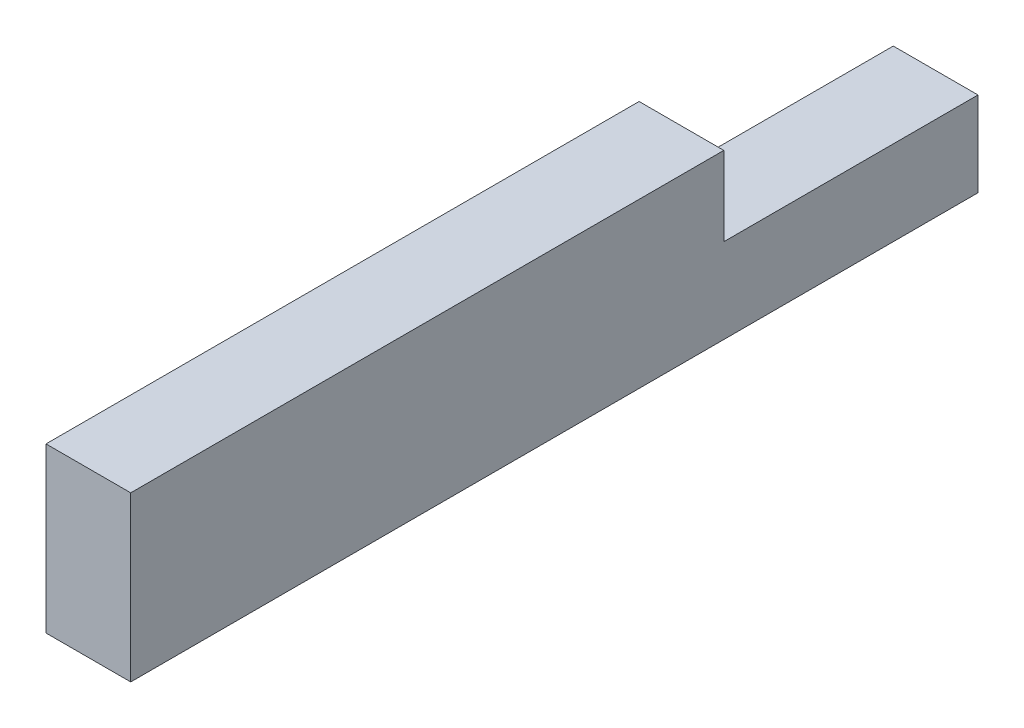
ISO-10303-21;
HEADER;
FILE_DESCRIPTION(('STEP AP214'),'2;1');
FILE_NAME('part.step','',(''),(''),'','','');
FILE_SCHEMA(('AUTOMOTIVE_DESIGN { 1 0 10303 214 1 1 1 1 }'));
ENDSEC;
DATA;
#1=APPLICATION_CONTEXT('core data for automotive mechanical design processes');
#2=APPLICATION_PROTOCOL_DEFINITION('international standard','automotive_design',2000,#1);
#3=PRODUCT_CONTEXT('',#1,'mechanical');
#4=PRODUCT('Part','Part','',(#3));
#5=PRODUCT_RELATED_PRODUCT_CATEGORY('part','',(#4));
#6=PRODUCT_DEFINITION_FORMATION('','',#4);
#7=PRODUCT_DEFINITION_CONTEXT('part definition',#1,'design');
#8=PRODUCT_DEFINITION('design','',#6,#7);
#9=PRODUCT_DEFINITION_SHAPE('','',#8);
#10=(LENGTH_UNIT() NAMED_UNIT(*) SI_UNIT(.MILLI.,.METRE.));
#11=(NAMED_UNIT(*) PLANE_ANGLE_UNIT() SI_UNIT($,.RADIAN.));
#12=(NAMED_UNIT(*) SI_UNIT($,.STERADIAN.) SOLID_ANGLE_UNIT());
#13=UNCERTAINTY_MEASURE_WITH_UNIT(LENGTH_MEASURE(1.E-05),#10,'distance_accuracy_value','');
#14=(GEOMETRIC_REPRESENTATION_CONTEXT(3) GLOBAL_UNCERTAINTY_ASSIGNED_CONTEXT((#13)) GLOBAL_UNIT_ASSIGNED_CONTEXT((#10,
#11,#12)) REPRESENTATION_CONTEXT('',''));
#15=CARTESIAN_POINT('',(0.,0.,0.));
#16=DIRECTION('',(0.,0.,1.));
#17=DIRECTION('',(1.,0.,0.));
#18=AXIS2_PLACEMENT_3D('',#15,#16,#17);
#19=CARTESIAN_POINT('',(1.5,1.5,30.));
#20=DIRECTION('',(0.,-1.,0.));
#21=DIRECTION('',(1.,0.,0.));
#22=AXIS2_PLACEMENT_3D('',#19,#20,#21);
#23=PLANE('',#22);
#24=DIRECTION('',(-1.,0.,0.));
#25=VECTOR('',#24,1.);
#26=CARTESIAN_POINT('',(-1.5,1.5,9.));
#27=LINE('',#26,#25);
#28=CARTESIAN_POINT('',(1.5,1.5,9.));
#29=VERTEX_POINT('',#28);
#30=CARTESIAN_POINT('',(-1.5,1.5,9.));
#31=VERTEX_POINT('',#30);
#32=EDGE_CURVE('E49',#29,#31,#27,.T.);
#33=ORIENTED_EDGE('',*,*,#32,.F.);
#34=DIRECTION('',(0.,0.,-1.));
#35=VECTOR('',#34,1.);
#36=CARTESIAN_POINT('',(1.5,1.5,30.));
#37=LINE('',#36,#35);
#38=CARTESIAN_POINT('',(1.5,1.5,0.));
#39=VERTEX_POINT('',#38);
#40=EDGE_CURVE('E85',#29,#39,#37,.T.);
#41=ORIENTED_EDGE('',*,*,#40,.T.);
#42=DIRECTION('',(-1.,0.,0.));
#43=VECTOR('',#42,1.);
#44=CARTESIAN_POINT('',(1.5,1.5,0.));
#45=LINE('',#44,#43);
#46=CARTESIAN_POINT('',(-1.5,1.5,0.));
#47=VERTEX_POINT('',#46);
#48=EDGE_CURVE('E89',#39,#47,#45,.T.);
#49=ORIENTED_EDGE('',*,*,#48,.T.);
#50=DIRECTION('',(0.,0.,-1.));
#51=VECTOR('',#50,1.);
#52=CARTESIAN_POINT('',(-1.5,1.5,30.));
#53=LINE('',#52,#51);
#54=EDGE_CURVE('E76',#31,#47,#53,.T.);
#55=ORIENTED_EDGE('',*,*,#54,.F.);
#56=EDGE_LOOP('',(#33,#41,#49,#55));
#57=FACE_BOUND('',#56,.T.);
#58=ADVANCED_FACE('F34',(#57),#23,.F.);
#59=CARTESIAN_POINT('',(-1.5,-1.5,30.));
#60=DIRECTION('',(1.,0.,0.));
#61=DIRECTION('',(0.,0.,-1.));
#62=AXIS2_PLACEMENT_3D('',#59,#60,#61);
#63=PLANE('',#62);
#64=DIRECTION('',(0.,-1.,0.));
#65=VECTOR('',#64,1.);
#66=CARTESIAN_POINT('',(-1.5,-1.5,0.));
#67=LINE('',#66,#65);
#68=CARTESIAN_POINT('',(-1.5,-1.5,0.));
#69=VERTEX_POINT('',#68);
#70=EDGE_CURVE('E80',#47,#69,#67,.T.);
#71=ORIENTED_EDGE('',*,*,#70,.T.);
#72=DIRECTION('',(0.,0.,-1.));
#73=VECTOR('',#72,1.);
#74=CARTESIAN_POINT('',(-1.5,-1.5,30.));
#75=LINE('',#74,#73);
#76=CARTESIAN_POINT('',(-1.5,-1.5,30.));
#77=VERTEX_POINT('',#76);
#78=EDGE_CURVE('E11',#77,#69,#75,.T.);
#79=ORIENTED_EDGE('',*,*,#78,.F.);
#80=DIRECTION('',(0.,-1.,0.));
#81=VECTOR('',#80,1.);
#82=CARTESIAN_POINT('',(-1.5,-1.5,30.));
#83=LINE('',#82,#81);
#84=CARTESIAN_POINT('',(-1.5,4.3,30.));
#85=VERTEX_POINT('',#84);
#86=EDGE_CURVE('E93',#85,#77,#83,.T.);
#87=ORIENTED_EDGE('',*,*,#86,.F.);
#88=DIRECTION('',(0.,0.,1.));
#89=VECTOR('',#88,1.);
#90=CARTESIAN_POINT('',(-1.5,4.3,30.));
#91=LINE('',#90,#89);
#92=CARTESIAN_POINT('',(-1.5,4.3,9.));
#93=VERTEX_POINT('',#92);
#94=EDGE_CURVE('E118',#93,#85,#91,.T.);
#95=ORIENTED_EDGE('',*,*,#94,.F.);
#96=DIRECTION('',(0.,-1.,0.));
#97=VECTOR('',#96,1.);
#98=CARTESIAN_POINT('',(-1.5,4.3,9.));
#99=LINE('',#98,#97);
#100=EDGE_CURVE('E84',#93,#31,#99,.T.);
#101=ORIENTED_EDGE('',*,*,#100,.T.);
#102=ORIENTED_EDGE('',*,*,#54,.T.);
#103=EDGE_LOOP('',(#71,#79,#87,#95,#101,#102));
#104=FACE_BOUND('',#103,.T.);
#105=ADVANCED_FACE('F36',(#104),#63,.F.);
#106=CARTESIAN_POINT('',(1.5,-1.5,30.));
#107=DIRECTION('',(0.,1.,0.));
#108=DIRECTION('',(-1.,0.,0.));
#109=AXIS2_PLACEMENT_3D('',#106,#107,#108);
#110=PLANE('',#109);
#111=DIRECTION('',(1.,0.,0.));
#112=VECTOR('',#111,1.);
#113=CARTESIAN_POINT('',(1.5,-1.5,0.));
#114=LINE('',#113,#112);
#115=CARTESIAN_POINT('',(1.5,-1.5,0.));
#116=VERTEX_POINT('',#115);
#117=EDGE_CURVE('E97',#69,#116,#114,.T.);
#118=ORIENTED_EDGE('',*,*,#117,.T.);
#119=DIRECTION('',(0.,0.,-1.));
#120=VECTOR('',#119,1.);
#121=CARTESIAN_POINT('',(1.5,-1.5,30.));
#122=LINE('',#121,#120);
#123=CARTESIAN_POINT('',(1.5,-1.5,30.));
#124=VERTEX_POINT('',#123);
#125=EDGE_CURVE('E42',#124,#116,#122,.T.);
#126=ORIENTED_EDGE('',*,*,#125,.F.);
#127=DIRECTION('',(1.,0.,0.));
#128=VECTOR('',#127,1.);
#129=CARTESIAN_POINT('',(1.5,-1.5,30.));
#130=LINE('',#129,#128);
#131=EDGE_CURVE('E58',#77,#124,#130,.T.);
#132=ORIENTED_EDGE('',*,*,#131,.F.);
#133=ORIENTED_EDGE('',*,*,#78,.T.);
#134=EDGE_LOOP('',(#118,#126,#132,#133));
#135=FACE_BOUND('',#134,.T.);
#136=ADVANCED_FACE('F113',(#135),#110,.F.);
#137=CARTESIAN_POINT('',(1.5,-1.5,30.));
#138=DIRECTION('',(-1.,0.,0.));
#139=DIRECTION('',(0.,0.,1.));
#140=AXIS2_PLACEMENT_3D('',#137,#138,#139);
#141=PLANE('',#140);
#142=DIRECTION('',(0.,1.,0.));
#143=VECTOR('',#142,1.);
#144=CARTESIAN_POINT('',(1.5,-1.5,0.));
#145=LINE('',#144,#143);
#146=EDGE_CURVE('E94',#116,#39,#145,.T.);
#147=ORIENTED_EDGE('',*,*,#146,.T.);
#148=ORIENTED_EDGE('',*,*,#40,.F.);
#149=DIRECTION('',(0.,-1.,0.));
#150=VECTOR('',#149,1.);
#151=CARTESIAN_POINT('',(1.5,4.3,9.));
#152=LINE('',#151,#150);
#153=CARTESIAN_POINT('',(1.5,4.3,9.));
#154=VERTEX_POINT('',#153);
#155=EDGE_CURVE('E98',#154,#29,#152,.T.);
#156=ORIENTED_EDGE('',*,*,#155,.F.);
#157=DIRECTION('',(0.,0.,-1.));
#158=VECTOR('',#157,1.);
#159=CARTESIAN_POINT('',(1.5,4.3,30.));
#160=LINE('',#159,#158);
#161=CARTESIAN_POINT('',(1.5,4.3,30.));
#162=VERTEX_POINT('',#161);
#163=EDGE_CURVE('E127',#162,#154,#160,.T.);
#164=ORIENTED_EDGE('',*,*,#163,.F.);
#165=DIRECTION('',(0.,1.,0.));
#166=VECTOR('',#165,1.);
#167=CARTESIAN_POINT('',(1.5,-1.5,30.));
#168=LINE('',#167,#166);
#169=EDGE_CURVE('E86',#124,#162,#168,.T.);
#170=ORIENTED_EDGE('',*,*,#169,.F.);
#171=ORIENTED_EDGE('',*,*,#125,.T.);
#172=EDGE_LOOP('',(#147,#148,#156,#164,#170,#171));
#173=FACE_BOUND('',#172,.T.);
#174=ADVANCED_FACE('F110',(#173),#141,.F.);
#175=CARTESIAN_POINT('',(0.,0.,30.));
#176=DIRECTION('',(0.,0.,1.));
#177=DIRECTION('',(1.,0.,0.));
#178=AXIS2_PLACEMENT_3D('',#175,#176,#177);
#179=PLANE('',#178);
#180=ORIENTED_EDGE('',*,*,#86,.T.);
#181=ORIENTED_EDGE('',*,*,#131,.T.);
#182=ORIENTED_EDGE('',*,*,#169,.T.);
#183=DIRECTION('',(1.,0.,0.));
#184=VECTOR('',#183,1.);
#185=CARTESIAN_POINT('',(-1.5,4.3,30.));
#186=LINE('',#185,#184);
#187=EDGE_CURVE('E123',#85,#162,#186,.T.);
#188=ORIENTED_EDGE('',*,*,#187,.F.);
#189=EDGE_LOOP('',(#180,#181,#182,#188));
#190=FACE_BOUND('',#189,.T.);
#191=ADVANCED_FACE('F124',(#190),#179,.T.);
#192=CARTESIAN_POINT('',(0.,0.,0.));
#193=DIRECTION('',(0.,0.,1.));
#194=DIRECTION('',(1.,0.,0.));
#195=AXIS2_PLACEMENT_3D('',#192,#193,#194);
#196=PLANE('',#195);
#197=ORIENTED_EDGE('',*,*,#70,.F.);
#198=ORIENTED_EDGE('',*,*,#48,.F.);
#199=ORIENTED_EDGE('',*,*,#146,.F.);
#200=ORIENTED_EDGE('',*,*,#117,.F.);
#201=EDGE_LOOP('',(#197,#198,#199,#200));
#202=FACE_BOUND('',#201,.T.);
#203=ADVANCED_FACE('F96',(#202),#196,.F.);
#204=CARTESIAN_POINT('',(-1.5,4.3,9.));
#205=DIRECTION('',(0.,0.,1.));
#206=DIRECTION('',(1.,0.,0.));
#207=AXIS2_PLACEMENT_3D('',#204,#205,#206);
#208=PLANE('',#207);
#209=ORIENTED_EDGE('',*,*,#32,.T.);
#210=ORIENTED_EDGE('',*,*,#100,.F.);
#211=DIRECTION('',(-1.,0.,0.));
#212=VECTOR('',#211,1.);
#213=CARTESIAN_POINT('',(-1.5,4.3,9.));
#214=LINE('',#213,#212);
#215=EDGE_CURVE('E132',#154,#93,#214,.T.);
#216=ORIENTED_EDGE('',*,*,#215,.F.);
#217=ORIENTED_EDGE('',*,*,#155,.T.);
#218=EDGE_LOOP('',(#209,#210,#216,#217));
#219=FACE_BOUND('',#218,.T.);
#220=ADVANCED_FACE('F142',(#219),#208,.F.);
#221=CARTESIAN_POINT('',(0.,4.3,0.));
#222=DIRECTION('',(0.,-1.,0.));
#223=DIRECTION('',(0.,0.,-1.));
#224=AXIS2_PLACEMENT_3D('',#221,#222,#223);
#225=PLANE('',#224);
#226=ORIENTED_EDGE('',*,*,#94,.T.);
#227=ORIENTED_EDGE('',*,*,#187,.T.);
#228=ORIENTED_EDGE('',*,*,#163,.T.);
#229=ORIENTED_EDGE('',*,*,#215,.T.);
#230=EDGE_LOOP('',(#226,#227,#228,#229));
#231=FACE_BOUND('',#230,.T.);
#232=ADVANCED_FACE('F130',(#231),#225,.F.);
#233=CLOSED_SHELL('',(#58,#105,#136,#174,#191,#203,#220,#232));
#234=MANIFOLD_SOLID_BREP('B2',#233);
#235=ADVANCED_BREP_SHAPE_REPRESENTATION('',(#18,#234),#14);
#236=SHAPE_DEFINITION_REPRESENTATION(#9,#235);
ENDSEC;
END-ISO-10303-21;
